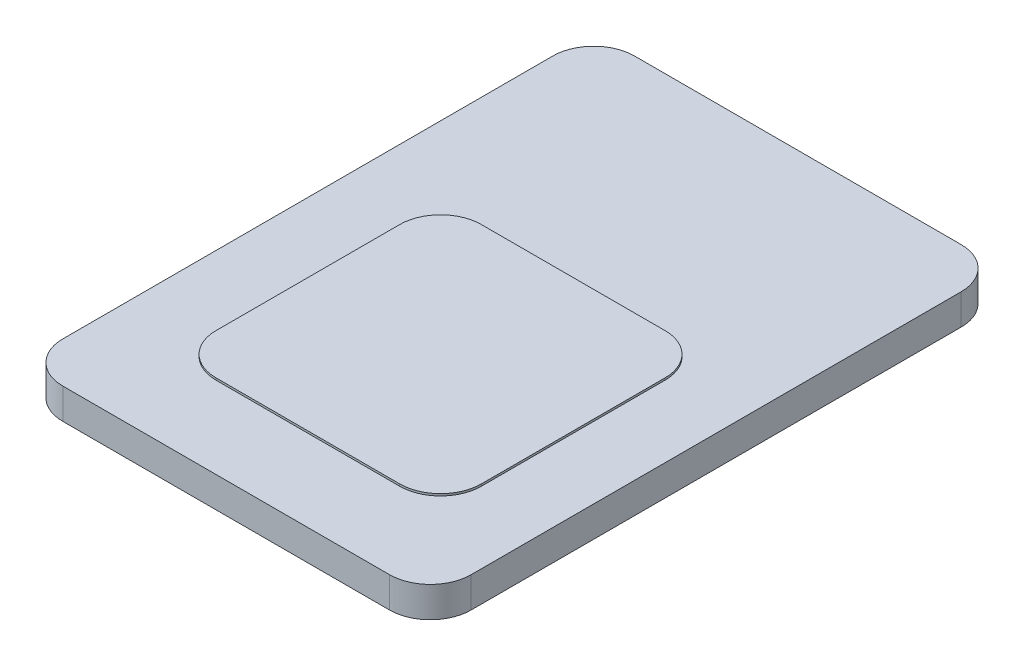
ISO-10303-21;
HEADER;
FILE_DESCRIPTION(('STEP AP214'),'2;1');
FILE_NAME('part.step','',(''),(''),'','','');
FILE_SCHEMA(('AUTOMOTIVE_DESIGN { 1 0 10303 214 1 1 1 1 }'));
ENDSEC;
DATA;
#1=APPLICATION_CONTEXT('core data for automotive mechanical design processes');
#2=APPLICATION_PROTOCOL_DEFINITION('international standard','automotive_design',2000,#1);
#3=PRODUCT_CONTEXT('',#1,'mechanical');
#4=PRODUCT('Part','Part','',(#3));
#5=PRODUCT_RELATED_PRODUCT_CATEGORY('part','',(#4));
#6=PRODUCT_DEFINITION_FORMATION('','',#4);
#7=PRODUCT_DEFINITION_CONTEXT('part definition',#1,'design');
#8=PRODUCT_DEFINITION('design','',#6,#7);
#9=PRODUCT_DEFINITION_SHAPE('','',#8);
#10=(LENGTH_UNIT() NAMED_UNIT(*) SI_UNIT(.MILLI.,.METRE.));
#11=(NAMED_UNIT(*) PLANE_ANGLE_UNIT() SI_UNIT($,.RADIAN.));
#12=(NAMED_UNIT(*) SI_UNIT($,.STERADIAN.) SOLID_ANGLE_UNIT());
#13=UNCERTAINTY_MEASURE_WITH_UNIT(LENGTH_MEASURE(1.E-05),#10,'distance_accuracy_value','');
#14=(GEOMETRIC_REPRESENTATION_CONTEXT(3) GLOBAL_UNCERTAINTY_ASSIGNED_CONTEXT((#13)) GLOBAL_UNIT_ASSIGNED_CONTEXT((#10,
#11,#12)) REPRESENTATION_CONTEXT('',''));
#15=CARTESIAN_POINT('',(0.,0.,0.));
#16=DIRECTION('',(0.,0.,1.));
#17=DIRECTION('',(1.,0.,0.));
#18=AXIS2_PLACEMENT_3D('',#15,#16,#17);
#19=CARTESIAN_POINT('',(0.,1.5,0.));
#20=DIRECTION('',(0.,-1.,0.));
#21=DIRECTION('',(0.,0.,-1.));
#22=AXIS2_PLACEMENT_3D('',#19,#20,#21);
#23=PLANE('',#22);
#24=DIRECTION('',(1.,0.,0.));
#25=VECTOR('',#24,1.);
#26=CARTESIAN_POINT('',(0.,1.5,0.));
#27=LINE('',#26,#25);
#28=CARTESIAN_POINT('',(2.,1.5,0.));
#29=VERTEX_POINT('',#28);
#30=CARTESIAN_POINT('',(18.,1.5,0.));
#31=VERTEX_POINT('',#30);
#32=EDGE_CURVE('E196',#29,#31,#27,.T.);
#33=ORIENTED_EDGE('',*,*,#32,.T.);
#34=CARTESIAN_POINT('',(18.,1.5,-2.));
#35=DIRECTION('',(0.,-1.,0.));
#36=DIRECTION('',(0.,0.,-1.));
#37=AXIS2_PLACEMENT_3D('',#34,#35,#36);
#38=CIRCLE('',#37,2.);
#39=CARTESIAN_POINT('',(20.,1.5,-2.));
#40=VERTEX_POINT('',#39);
#41=EDGE_CURVE('E250',#31,#40,#38,.F.);
#42=ORIENTED_EDGE('',*,*,#41,.T.);
#43=DIRECTION('',(0.,0.,-1.));
#44=VECTOR('',#43,1.);
#45=CARTESIAN_POINT('',(20.,1.5,0.));
#46=LINE('',#45,#44);
#47=CARTESIAN_POINT('',(20.,1.5,-26.));
#48=VERTEX_POINT('',#47);
#49=EDGE_CURVE('E201',#40,#48,#46,.T.);
#50=ORIENTED_EDGE('',*,*,#49,.T.);
#51=CARTESIAN_POINT('',(18.,1.5,-26.));
#52=DIRECTION('',(0.,-1.,0.));
#53=DIRECTION('',(0.,0.,-1.));
#54=AXIS2_PLACEMENT_3D('',#51,#52,#53);
#55=CIRCLE('',#54,2.);
#56=CARTESIAN_POINT('',(18.,1.5,-28.));
#57=VERTEX_POINT('',#56);
#58=EDGE_CURVE('E60',#48,#57,#55,.F.);
#59=ORIENTED_EDGE('',*,*,#58,.T.);
#60=DIRECTION('',(-1.,0.,0.));
#61=VECTOR('',#60,1.);
#62=CARTESIAN_POINT('',(0.,1.5,-28.));
#63=LINE('',#62,#61);
#64=CARTESIAN_POINT('',(2.,1.5,-28.));
#65=VERTEX_POINT('',#64);
#66=EDGE_CURVE('E204',#57,#65,#63,.T.);
#67=ORIENTED_EDGE('',*,*,#66,.T.);
#68=CARTESIAN_POINT('',(2.,1.5,-26.));
#69=DIRECTION('',(0.,-1.,0.));
#70=DIRECTION('',(0.,0.,-1.));
#71=AXIS2_PLACEMENT_3D('',#68,#69,#70);
#72=CIRCLE('',#71,2.);
#73=CARTESIAN_POINT('',(0.,1.5,-26.));
#74=VERTEX_POINT('',#73);
#75=EDGE_CURVE('E244',#65,#74,#72,.F.);
#76=ORIENTED_EDGE('',*,*,#75,.T.);
#77=DIRECTION('',(0.,0.,1.));
#78=VECTOR('',#77,1.);
#79=CARTESIAN_POINT('',(0.,1.5,0.));
#80=LINE('',#79,#78);
#81=CARTESIAN_POINT('',(0.,1.5,-2.));
#82=VERTEX_POINT('',#81);
#83=EDGE_CURVE('E192',#74,#82,#80,.T.);
#84=ORIENTED_EDGE('',*,*,#83,.T.);
#85=CARTESIAN_POINT('',(2.,1.5,-2.));
#86=DIRECTION('',(0.,-1.,0.));
#87=DIRECTION('',(0.,0.,-1.));
#88=AXIS2_PLACEMENT_3D('',#85,#86,#87);
#89=CIRCLE('',#88,2.);
#90=EDGE_CURVE('E247',#82,#29,#89,.F.);
#91=ORIENTED_EDGE('',*,*,#90,.T.);
#92=EDGE_LOOP('',(#33,#42,#50,#59,#67,#76,#84,#91));
#93=FACE_BOUND('',#92,.T.);
#94=CARTESIAN_POINT('',(5.5,1.5,-6.));
#95=DIRECTION('',(0.,1.,0.));
#96=DIRECTION('',(0.,0.,1.));
#97=AXIS2_PLACEMENT_3D('',#94,#95,#96);
#98=CIRCLE('',#97,2.);
#99=CARTESIAN_POINT('',(3.5,1.5,-6.00000000000001));
#100=VERTEX_POINT('',#99);
#101=CARTESIAN_POINT('',(5.50000000000002,1.5,-4.));
#102=VERTEX_POINT('',#101);
#103=EDGE_CURVE('E179',#100,#102,#98,.T.);
#104=ORIENTED_EDGE('',*,*,#103,.F.);
#105=DIRECTION('',(0.,0.,1.));
#106=VECTOR('',#105,1.);
#107=CARTESIAN_POINT('',(3.5,1.5,-15.));
#108=LINE('',#107,#106);
#109=CARTESIAN_POINT('',(3.5,1.5,-15.));
#110=VERTEX_POINT('',#109);
#111=EDGE_CURVE('E176',#110,#100,#108,.T.);
#112=ORIENTED_EDGE('',*,*,#111,.F.);
#113=CARTESIAN_POINT('',(5.5,1.5,-15.));
#114=DIRECTION('',(0.,1.,0.));
#115=DIRECTION('',(0.,0.,-1.));
#116=AXIS2_PLACEMENT_3D('',#113,#114,#115);
#117=CIRCLE('',#116,2.);
#118=CARTESIAN_POINT('',(5.5,1.5,-17.));
#119=VERTEX_POINT('',#118);
#120=EDGE_CURVE('E493',#119,#110,#117,.T.);
#121=ORIENTED_EDGE('',*,*,#120,.F.);
#122=DIRECTION('',(-1.,0.,0.));
#123=VECTOR('',#122,1.);
#124=CARTESIAN_POINT('',(5.50000000000001,1.5,-17.));
#125=LINE('',#124,#123);
#126=CARTESIAN_POINT('',(14.5,1.5,-17.));
#127=VERTEX_POINT('',#126);
#128=EDGE_CURVE('E497',#127,#119,#125,.T.);
#129=ORIENTED_EDGE('',*,*,#128,.F.);
#130=CARTESIAN_POINT('',(14.5,1.5,-15.));
#131=DIRECTION('',(0.,1.,0.));
#132=DIRECTION('',(0.,0.,-1.));
#133=AXIS2_PLACEMENT_3D('',#130,#131,#132);
#134=CIRCLE('',#133,2.);
#135=CARTESIAN_POINT('',(16.5,1.5,-15.));
#136=VERTEX_POINT('',#135);
#137=EDGE_CURVE('E501',#136,#127,#134,.T.);
#138=ORIENTED_EDGE('',*,*,#137,.F.);
#139=DIRECTION('',(0.,0.,-1.));
#140=VECTOR('',#139,1.);
#141=CARTESIAN_POINT('',(16.5,1.5,-15.));
#142=LINE('',#141,#140);
#143=CARTESIAN_POINT('',(16.5,1.5,-6.00000000000001));
#144=VERTEX_POINT('',#143);
#145=EDGE_CURVE('E463',#144,#136,#142,.T.);
#146=ORIENTED_EDGE('',*,*,#145,.F.);
#147=CARTESIAN_POINT('',(14.5,1.5,-6.));
#148=DIRECTION('',(0.,1.,0.));
#149=DIRECTION('',(0.,0.,-1.));
#150=AXIS2_PLACEMENT_3D('',#147,#148,#149);
#151=CIRCLE('',#150,2.);
#152=CARTESIAN_POINT('',(14.5,1.5,-4.));
#153=VERTEX_POINT('',#152);
#154=EDGE_CURVE('E459',#153,#144,#151,.T.);
#155=ORIENTED_EDGE('',*,*,#154,.F.);
#156=DIRECTION('',(1.,0.,0.));
#157=VECTOR('',#156,1.);
#158=CARTESIAN_POINT('',(5.50000000000002,1.5,-4.));
#159=LINE('',#158,#157);
#160=EDGE_CURVE('E464',#102,#153,#159,.T.);
#161=ORIENTED_EDGE('',*,*,#160,.F.);
#162=EDGE_LOOP('',(#104,#112,#121,#129,#138,#146,#155,#161));
#163=FACE_BOUND('',#162,.T.);
#164=ADVANCED_FACE('F39',(#93,#163),#23,.F.);
#165=CARTESIAN_POINT('',(0.,1.5,0.));
#166=DIRECTION('',(1.,0.,0.));
#167=DIRECTION('',(0.,0.,-1.));
#168=AXIS2_PLACEMENT_3D('',#165,#166,#167);
#169=PLANE('',#168);
#170=DIRECTION('',(0.,0.,1.));
#171=VECTOR('',#170,1.);
#172=CARTESIAN_POINT('',(0.,0.,0.));
#173=LINE('',#172,#171);
#174=CARTESIAN_POINT('',(0.,0.,-26.));
#175=VERTEX_POINT('',#174);
#176=CARTESIAN_POINT('',(0.,0.,-2.));
#177=VERTEX_POINT('',#176);
#178=EDGE_CURVE('E181',#175,#177,#173,.T.);
#179=ORIENTED_EDGE('',*,*,#178,.T.);
#180=DIRECTION('',(0.,-1.,0.));
#181=VECTOR('',#180,1.);
#182=CARTESIAN_POINT('',(0.,1.5,-2.));
#183=LINE('',#182,#181);
#184=EDGE_CURVE('E257',#177,#82,#183,.F.);
#185=ORIENTED_EDGE('',*,*,#184,.T.);
#186=ORIENTED_EDGE('',*,*,#83,.F.);
#187=DIRECTION('',(0.,-1.,0.));
#188=VECTOR('',#187,1.);
#189=CARTESIAN_POINT('',(0.,1.5,-26.));
#190=LINE('',#189,#188);
#191=EDGE_CURVE('E253',#74,#175,#190,.T.);
#192=ORIENTED_EDGE('',*,*,#191,.T.);
#193=EDGE_LOOP('',(#179,#185,#186,#192));
#194=FACE_BOUND('',#193,.T.);
#195=ADVANCED_FACE('F275',(#194),#169,.F.);
#196=CARTESIAN_POINT('',(0.,1.5,0.));
#197=DIRECTION('',(0.,0.,-1.));
#198=DIRECTION('',(-1.,0.,0.));
#199=AXIS2_PLACEMENT_3D('',#196,#197,#198);
#200=PLANE('',#199);
#201=DIRECTION('',(1.,0.,0.));
#202=VECTOR('',#201,1.);
#203=CARTESIAN_POINT('',(0.,0.,0.));
#204=LINE('',#203,#202);
#205=CARTESIAN_POINT('',(2.,0.,0.));
#206=VERTEX_POINT('',#205);
#207=CARTESIAN_POINT('',(18.,0.,0.));
#208=VERTEX_POINT('',#207);
#209=EDGE_CURVE('E186',#206,#208,#204,.T.);
#210=ORIENTED_EDGE('',*,*,#209,.T.);
#211=DIRECTION('',(0.,-1.,0.));
#212=VECTOR('',#211,1.);
#213=CARTESIAN_POINT('',(18.,1.5,0.));
#214=LINE('',#213,#212);
#215=EDGE_CURVE('E239',#208,#31,#214,.F.);
#216=ORIENTED_EDGE('',*,*,#215,.T.);
#217=ORIENTED_EDGE('',*,*,#32,.F.);
#218=DIRECTION('',(0.,-1.,0.));
#219=VECTOR('',#218,1.);
#220=CARTESIAN_POINT('',(2.,1.5,0.));
#221=LINE('',#220,#219);
#222=EDGE_CURVE('E235',#29,#206,#221,.T.);
#223=ORIENTED_EDGE('',*,*,#222,.T.);
#224=EDGE_LOOP('',(#210,#216,#217,#223));
#225=FACE_BOUND('',#224,.T.);
#226=ADVANCED_FACE('F285',(#225),#200,.F.);
#227=CARTESIAN_POINT('',(20.,1.5,0.));
#228=DIRECTION('',(-1.,0.,0.));
#229=DIRECTION('',(0.,0.,1.));
#230=AXIS2_PLACEMENT_3D('',#227,#228,#229);
#231=PLANE('',#230);
#232=ORIENTED_EDGE('',*,*,#49,.F.);
#233=DIRECTION('',(0.,-1.,0.));
#234=VECTOR('',#233,1.);
#235=CARTESIAN_POINT('',(20.,1.5,-2.));
#236=LINE('',#235,#234);
#237=CARTESIAN_POINT('',(20.,0.,-2.));
#238=VERTEX_POINT('',#237);
#239=EDGE_CURVE('E219',#40,#238,#236,.T.);
#240=ORIENTED_EDGE('',*,*,#239,.T.);
#241=DIRECTION('',(0.,0.,-1.));
#242=VECTOR('',#241,1.);
#243=CARTESIAN_POINT('',(20.,0.,0.));
#244=LINE('',#243,#242);
#245=CARTESIAN_POINT('',(20.,0.,-26.));
#246=VERTEX_POINT('',#245);
#247=EDGE_CURVE('E211',#238,#246,#244,.T.);
#248=ORIENTED_EDGE('',*,*,#247,.T.);
#249=DIRECTION('',(0.,-1.,0.));
#250=VECTOR('',#249,1.);
#251=CARTESIAN_POINT('',(20.,1.5,-26.));
#252=LINE('',#251,#250);
#253=EDGE_CURVE('E206',#246,#48,#252,.F.);
#254=ORIENTED_EDGE('',*,*,#253,.T.);
#255=EDGE_LOOP('',(#232,#240,#248,#254));
#256=FACE_BOUND('',#255,.T.);
#257=ADVANCED_FACE('F293',(#256),#231,.F.);
#258=CARTESIAN_POINT('',(0.,1.5,-28.));
#259=DIRECTION('',(0.,0.,1.));
#260=DIRECTION('',(1.,0.,0.));
#261=AXIS2_PLACEMENT_3D('',#258,#259,#260);
#262=PLANE('',#261);
#263=DIRECTION('',(-1.,0.,0.));
#264=VECTOR('',#263,1.);
#265=CARTESIAN_POINT('',(0.,0.,-28.));
#266=LINE('',#265,#264);
#267=CARTESIAN_POINT('',(18.,0.,-28.));
#268=VERTEX_POINT('',#267);
#269=CARTESIAN_POINT('',(2.,0.,-28.));
#270=VERTEX_POINT('',#269);
#271=EDGE_CURVE('E197',#268,#270,#266,.T.);
#272=ORIENTED_EDGE('',*,*,#271,.T.);
#273=DIRECTION('',(0.,-1.,0.));
#274=VECTOR('',#273,1.);
#275=CARTESIAN_POINT('',(2.,1.5,-28.));
#276=LINE('',#275,#274);
#277=EDGE_CURVE('E11',#270,#65,#276,.F.);
#278=ORIENTED_EDGE('',*,*,#277,.T.);
#279=ORIENTED_EDGE('',*,*,#66,.F.);
#280=DIRECTION('',(0.,-1.,0.));
#281=VECTOR('',#280,1.);
#282=CARTESIAN_POINT('',(18.,1.5,-28.));
#283=LINE('',#282,#281);
#284=EDGE_CURVE('E48',#57,#268,#283,.T.);
#285=ORIENTED_EDGE('',*,*,#284,.T.);
#286=EDGE_LOOP('',(#272,#278,#279,#285));
#287=FACE_BOUND('',#286,.T.);
#288=ADVANCED_FACE('F263',(#287),#262,.F.);
#289=CARTESIAN_POINT('',(0.,0.,0.));
#290=DIRECTION('',(0.,-1.,0.));
#291=DIRECTION('',(0.,0.,-1.));
#292=AXIS2_PLACEMENT_3D('',#289,#290,#291);
#293=PLANE('',#292);
#294=ORIENTED_EDGE('',*,*,#247,.F.);
#295=CARTESIAN_POINT('',(18.,0.,-2.));
#296=DIRECTION('',(0.,-1.,0.));
#297=DIRECTION('',(0.,0.,-1.));
#298=AXIS2_PLACEMENT_3D('',#295,#296,#297);
#299=CIRCLE('',#298,2.);
#300=EDGE_CURVE('E232',#238,#208,#299,.T.);
#301=ORIENTED_EDGE('',*,*,#300,.T.);
#302=ORIENTED_EDGE('',*,*,#209,.F.);
#303=CARTESIAN_POINT('',(2.,0.,-2.));
#304=DIRECTION('',(0.,-1.,0.));
#305=DIRECTION('',(0.,0.,-1.));
#306=AXIS2_PLACEMENT_3D('',#303,#304,#305);
#307=CIRCLE('',#306,2.);
#308=EDGE_CURVE('E229',#206,#177,#307,.T.);
#309=ORIENTED_EDGE('',*,*,#308,.T.);
#310=ORIENTED_EDGE('',*,*,#178,.F.);
#311=CARTESIAN_POINT('',(2.,0.,-26.));
#312=DIRECTION('',(0.,-1.,0.));
#313=DIRECTION('',(0.,0.,-1.));
#314=AXIS2_PLACEMENT_3D('',#311,#312,#313);
#315=CIRCLE('',#314,2.);
#316=EDGE_CURVE('E226',#175,#270,#315,.T.);
#317=ORIENTED_EDGE('',*,*,#316,.T.);
#318=ORIENTED_EDGE('',*,*,#271,.F.);
#319=CARTESIAN_POINT('',(18.,0.,-26.));
#320=DIRECTION('',(0.,-1.,0.));
#321=DIRECTION('',(0.,0.,-1.));
#322=AXIS2_PLACEMENT_3D('',#319,#320,#321);
#323=CIRCLE('',#322,2.);
#324=EDGE_CURVE('E223',#268,#246,#323,.T.);
#325=ORIENTED_EDGE('',*,*,#324,.T.);
#326=EDGE_LOOP('',(#294,#301,#302,#309,#310,#317,#318,#325));
#327=FACE_BOUND('',#326,.T.);
#328=ADVANCED_FACE('F267',(#327),#293,.T.);
#329=CARTESIAN_POINT('',(5.5,1.6,-6.));
#330=DIRECTION('',(0.,-1.,0.));
#331=DIRECTION('',(0.,0.,-1.));
#332=AXIS2_PLACEMENT_3D('',#329,#330,#331);
#333=CYLINDRICAL_SURFACE('',#332,2.);
#334=ORIENTED_EDGE('',*,*,#103,.T.);
#335=DIRECTION('',(0.,-1.,0.));
#336=VECTOR('',#335,1.);
#337=CARTESIAN_POINT('',(5.50000000000002,1.6,-4.));
#338=LINE('',#337,#336);
#339=CARTESIAN_POINT('',(5.50000000000002,1.6,-4.));
#340=VERTEX_POINT('',#339);
#341=EDGE_CURVE('E158',#340,#102,#338,.T.);
#342=ORIENTED_EDGE('',*,*,#341,.F.);
#343=CARTESIAN_POINT('',(5.5,1.6,-6.));
#344=DIRECTION('',(0.,1.,0.));
#345=DIRECTION('',(0.,0.,1.));
#346=AXIS2_PLACEMENT_3D('',#343,#344,#345);
#347=CIRCLE('',#346,2.);
#348=CARTESIAN_POINT('',(3.5,1.6,-6.00000000000001));
#349=VERTEX_POINT('',#348);
#350=EDGE_CURVE('E166',#349,#340,#347,.T.);
#351=ORIENTED_EDGE('',*,*,#350,.F.);
#352=DIRECTION('',(0.,-1.,0.));
#353=VECTOR('',#352,1.);
#354=CARTESIAN_POINT('',(3.5,1.6,-6.00000000000001));
#355=LINE('',#354,#353);
#356=EDGE_CURVE('E487',#349,#100,#355,.T.);
#357=ORIENTED_EDGE('',*,*,#356,.T.);
#358=EDGE_LOOP('',(#334,#342,#351,#357));
#359=FACE_BOUND('',#358,.T.);
#360=ADVANCED_FACE('F178',(#359),#333,.T.);
#361=CARTESIAN_POINT('',(5.50000000000002,1.6,-4.));
#362=DIRECTION('',(0.,0.,-1.));
#363=DIRECTION('',(-1.,0.,0.));
#364=AXIS2_PLACEMENT_3D('',#361,#362,#363);
#365=PLANE('',#364);
#366=ORIENTED_EDGE('',*,*,#160,.T.);
#367=DIRECTION('',(0.,-1.,0.));
#368=VECTOR('',#367,1.);
#369=CARTESIAN_POINT('',(14.5,1.6,-4.));
#370=LINE('',#369,#368);
#371=CARTESIAN_POINT('',(14.5,1.6,-4.));
#372=VERTEX_POINT('',#371);
#373=EDGE_CURVE('E161',#372,#153,#370,.T.);
#374=ORIENTED_EDGE('',*,*,#373,.F.);
#375=DIRECTION('',(1.,0.,0.));
#376=VECTOR('',#375,1.);
#377=CARTESIAN_POINT('',(5.50000000000002,1.6,-4.));
#378=LINE('',#377,#376);
#379=EDGE_CURVE('E153',#340,#372,#378,.T.);
#380=ORIENTED_EDGE('',*,*,#379,.F.);
#381=ORIENTED_EDGE('',*,*,#341,.T.);
#382=EDGE_LOOP('',(#366,#374,#380,#381));
#383=FACE_BOUND('',#382,.T.);
#384=ADVANCED_FACE('F156',(#383),#365,.F.);
#385=CARTESIAN_POINT('',(14.5,1.6,-6.));
#386=DIRECTION('',(0.,-1.,0.));
#387=DIRECTION('',(0.,0.,-1.));
#388=AXIS2_PLACEMENT_3D('',#385,#386,#387);
#389=CYLINDRICAL_SURFACE('',#388,2.);
#390=ORIENTED_EDGE('',*,*,#154,.T.);
#391=DIRECTION('',(0.,-1.,0.));
#392=VECTOR('',#391,1.);
#393=CARTESIAN_POINT('',(16.5,1.6,-6.00000000000001));
#394=LINE('',#393,#392);
#395=CARTESIAN_POINT('',(16.5,1.6,-6.00000000000001));
#396=VERTEX_POINT('',#395);
#397=EDGE_CURVE('E188',#396,#144,#394,.T.);
#398=ORIENTED_EDGE('',*,*,#397,.F.);
#399=CARTESIAN_POINT('',(14.5,1.6,-6.));
#400=DIRECTION('',(0.,1.,0.));
#401=DIRECTION('',(0.,0.,-1.));
#402=AXIS2_PLACEMENT_3D('',#399,#400,#401);
#403=CIRCLE('',#402,2.);
#404=EDGE_CURVE('E165',#372,#396,#403,.T.);
#405=ORIENTED_EDGE('',*,*,#404,.F.);
#406=ORIENTED_EDGE('',*,*,#373,.T.);
#407=EDGE_LOOP('',(#390,#398,#405,#406));
#408=FACE_BOUND('',#407,.T.);
#409=ADVANCED_FACE('F392',(#408),#389,.T.);
#410=CARTESIAN_POINT('',(16.5,1.6,-15.));
#411=DIRECTION('',(-1.,0.,0.));
#412=DIRECTION('',(0.,0.,1.));
#413=AXIS2_PLACEMENT_3D('',#410,#411,#412);
#414=PLANE('',#413);
#415=ORIENTED_EDGE('',*,*,#145,.T.);
#416=DIRECTION('',(0.,-1.,0.));
#417=VECTOR('',#416,1.);
#418=CARTESIAN_POINT('',(16.5,1.6,-15.));
#419=LINE('',#418,#417);
#420=CARTESIAN_POINT('',(16.5,1.6,-15.));
#421=VERTEX_POINT('',#420);
#422=EDGE_CURVE('E471',#421,#136,#419,.T.);
#423=ORIENTED_EDGE('',*,*,#422,.F.);
#424=DIRECTION('',(0.,0.,-1.));
#425=VECTOR('',#424,1.);
#426=CARTESIAN_POINT('',(16.5,1.6,-15.));
#427=LINE('',#426,#425);
#428=EDGE_CURVE('E469',#396,#421,#427,.T.);
#429=ORIENTED_EDGE('',*,*,#428,.F.);
#430=ORIENTED_EDGE('',*,*,#397,.T.);
#431=EDGE_LOOP('',(#415,#423,#429,#430));
#432=FACE_BOUND('',#431,.T.);
#433=ADVANCED_FACE('F383',(#432),#414,.F.);
#434=CARTESIAN_POINT('',(14.5,1.6,-15.));
#435=DIRECTION('',(0.,-1.,0.));
#436=DIRECTION('',(0.,0.,-1.));
#437=AXIS2_PLACEMENT_3D('',#434,#435,#436);
#438=CYLINDRICAL_SURFACE('',#437,2.);
#439=ORIENTED_EDGE('',*,*,#137,.T.);
#440=DIRECTION('',(0.,-1.,0.));
#441=VECTOR('',#440,1.);
#442=CARTESIAN_POINT('',(14.5,1.6,-17.));
#443=LINE('',#442,#441);
#444=CARTESIAN_POINT('',(14.5,1.6,-17.));
#445=VERTEX_POINT('',#444);
#446=EDGE_CURVE('E473',#445,#127,#443,.T.);
#447=ORIENTED_EDGE('',*,*,#446,.F.);
#448=CARTESIAN_POINT('',(14.5,1.6,-15.));
#449=DIRECTION('',(0.,1.,0.));
#450=DIRECTION('',(0.,0.,-1.));
#451=AXIS2_PLACEMENT_3D('',#448,#449,#450);
#452=CIRCLE('',#451,2.);
#453=EDGE_CURVE('E519',#421,#445,#452,.T.);
#454=ORIENTED_EDGE('',*,*,#453,.F.);
#455=ORIENTED_EDGE('',*,*,#422,.T.);
#456=EDGE_LOOP('',(#439,#447,#454,#455));
#457=FACE_BOUND('',#456,.T.);
#458=ADVANCED_FACE('F374',(#457),#438,.T.);
#459=CARTESIAN_POINT('',(5.50000000000001,1.6,-17.));
#460=DIRECTION('',(0.,0.,1.));
#461=DIRECTION('',(1.,0.,0.));
#462=AXIS2_PLACEMENT_3D('',#459,#460,#461);
#463=PLANE('',#462);
#464=ORIENTED_EDGE('',*,*,#128,.T.);
#465=DIRECTION('',(0.,-1.,0.));
#466=VECTOR('',#465,1.);
#467=CARTESIAN_POINT('',(5.5,1.6,-17.));
#468=LINE('',#467,#466);
#469=CARTESIAN_POINT('',(5.5,1.6,-17.));
#470=VERTEX_POINT('',#469);
#471=EDGE_CURVE('E479',#470,#119,#468,.T.);
#472=ORIENTED_EDGE('',*,*,#471,.F.);
#473=DIRECTION('',(-1.,0.,0.));
#474=VECTOR('',#473,1.);
#475=CARTESIAN_POINT('',(5.50000000000001,1.6,-17.));
#476=LINE('',#475,#474);
#477=EDGE_CURVE('E516',#445,#470,#476,.T.);
#478=ORIENTED_EDGE('',*,*,#477,.F.);
#479=ORIENTED_EDGE('',*,*,#446,.T.);
#480=EDGE_LOOP('',(#464,#472,#478,#479));
#481=FACE_BOUND('',#480,.T.);
#482=ADVANCED_FACE('F365',(#481),#463,.F.);
#483=CARTESIAN_POINT('',(5.5,1.6,-15.));
#484=DIRECTION('',(0.,-1.,0.));
#485=DIRECTION('',(0.,0.,-1.));
#486=AXIS2_PLACEMENT_3D('',#483,#484,#485);
#487=CYLINDRICAL_SURFACE('',#486,2.);
#488=ORIENTED_EDGE('',*,*,#120,.T.);
#489=DIRECTION('',(0.,-1.,0.));
#490=VECTOR('',#489,1.);
#491=CARTESIAN_POINT('',(3.5,1.6,-15.));
#492=LINE('',#491,#490);
#493=CARTESIAN_POINT('',(3.5,1.6,-15.));
#494=VERTEX_POINT('',#493);
#495=EDGE_CURVE('E483',#494,#110,#492,.T.);
#496=ORIENTED_EDGE('',*,*,#495,.F.);
#497=CARTESIAN_POINT('',(5.5,1.6,-15.));
#498=DIRECTION('',(0.,1.,0.));
#499=DIRECTION('',(0.,0.,-1.));
#500=AXIS2_PLACEMENT_3D('',#497,#498,#499);
#501=CIRCLE('',#500,2.);
#502=EDGE_CURVE('E513',#470,#494,#501,.T.);
#503=ORIENTED_EDGE('',*,*,#502,.F.);
#504=ORIENTED_EDGE('',*,*,#471,.T.);
#505=EDGE_LOOP('',(#488,#496,#503,#504));
#506=FACE_BOUND('',#505,.T.);
#507=ADVANCED_FACE('F356',(#506),#487,.T.);
#508=CARTESIAN_POINT('',(3.5,1.6,-15.));
#509=DIRECTION('',(1.,0.,0.));
#510=DIRECTION('',(0.,0.,-1.));
#511=AXIS2_PLACEMENT_3D('',#508,#509,#510);
#512=PLANE('',#511);
#513=ORIENTED_EDGE('',*,*,#111,.T.);
#514=ORIENTED_EDGE('',*,*,#356,.F.);
#515=DIRECTION('',(0.,0.,1.));
#516=VECTOR('',#515,1.);
#517=CARTESIAN_POINT('',(3.5,1.6,-15.));
#518=LINE('',#517,#516);
#519=EDGE_CURVE('E171',#494,#349,#518,.T.);
#520=ORIENTED_EDGE('',*,*,#519,.F.);
#521=ORIENTED_EDGE('',*,*,#495,.T.);
#522=EDGE_LOOP('',(#513,#514,#520,#521));
#523=FACE_BOUND('',#522,.T.);
#524=ADVANCED_FACE('F348',(#523),#512,.F.);
#525=CARTESIAN_POINT('',(5.5,1.6,-6.));
#526=DIRECTION('',(0.,1.,0.));
#527=DIRECTION('',(0.,0.,1.));
#528=AXIS2_PLACEMENT_3D('',#525,#526,#527);
#529=PLANE('',#528);
#530=ORIENTED_EDGE('',*,*,#350,.T.);
#531=ORIENTED_EDGE('',*,*,#379,.T.);
#532=ORIENTED_EDGE('',*,*,#404,.T.);
#533=ORIENTED_EDGE('',*,*,#428,.T.);
#534=ORIENTED_EDGE('',*,*,#453,.T.);
#535=ORIENTED_EDGE('',*,*,#477,.T.);
#536=ORIENTED_EDGE('',*,*,#502,.T.);
#537=ORIENTED_EDGE('',*,*,#519,.T.);
#538=EDGE_LOOP('',(#530,#531,#532,#533,#534,#535,#536,#537));
#539=FACE_BOUND('',#538,.T.);
#540=ADVANCED_FACE('F169',(#539),#529,.T.);
#541=CARTESIAN_POINT('',(18.,1.5,-2.));
#542=DIRECTION('',(0.,-1.,0.));
#543=DIRECTION('',(0.,0.,-1.));
#544=AXIS2_PLACEMENT_3D('',#541,#542,#543);
#545=CYLINDRICAL_SURFACE('',#544,2.);
#546=ORIENTED_EDGE('',*,*,#41,.F.);
#547=ORIENTED_EDGE('',*,*,#215,.F.);
#548=ORIENTED_EDGE('',*,*,#300,.F.);
#549=ORIENTED_EDGE('',*,*,#239,.F.);
#550=EDGE_LOOP('',(#546,#547,#548,#549));
#551=FACE_BOUND('',#550,.T.);
#552=ADVANCED_FACE('F290',(#551),#545,.T.);
#553=CARTESIAN_POINT('',(2.,1.5,-2.));
#554=DIRECTION('',(0.,-1.,0.));
#555=DIRECTION('',(0.,0.,-1.));
#556=AXIS2_PLACEMENT_3D('',#553,#554,#555);
#557=CYLINDRICAL_SURFACE('',#556,2.);
#558=ORIENTED_EDGE('',*,*,#90,.F.);
#559=ORIENTED_EDGE('',*,*,#184,.F.);
#560=ORIENTED_EDGE('',*,*,#308,.F.);
#561=ORIENTED_EDGE('',*,*,#222,.F.);
#562=EDGE_LOOP('',(#558,#559,#560,#561));
#563=FACE_BOUND('',#562,.T.);
#564=ADVANCED_FACE('F282',(#563),#557,.T.);
#565=CARTESIAN_POINT('',(2.,1.5,-26.));
#566=DIRECTION('',(0.,-1.,0.));
#567=DIRECTION('',(0.,0.,-1.));
#568=AXIS2_PLACEMENT_3D('',#565,#566,#567);
#569=CYLINDRICAL_SURFACE('',#568,2.);
#570=ORIENTED_EDGE('',*,*,#75,.F.);
#571=ORIENTED_EDGE('',*,*,#277,.F.);
#572=ORIENTED_EDGE('',*,*,#316,.F.);
#573=ORIENTED_EDGE('',*,*,#191,.F.);
#574=EDGE_LOOP('',(#570,#571,#572,#573));
#575=FACE_BOUND('',#574,.T.);
#576=ADVANCED_FACE('F272',(#575),#569,.T.);
#577=CARTESIAN_POINT('',(18.,1.5,-26.));
#578=DIRECTION('',(0.,-1.,0.));
#579=DIRECTION('',(0.,0.,-1.));
#580=AXIS2_PLACEMENT_3D('',#577,#578,#579);
#581=CYLINDRICAL_SURFACE('',#580,2.);
#582=ORIENTED_EDGE('',*,*,#58,.F.);
#583=ORIENTED_EDGE('',*,*,#253,.F.);
#584=ORIENTED_EDGE('',*,*,#324,.F.);
#585=ORIENTED_EDGE('',*,*,#284,.F.);
#586=EDGE_LOOP('',(#582,#583,#584,#585));
#587=FACE_BOUND('',#586,.T.);
#588=ADVANCED_FACE('F41',(#587),#581,.T.);
#589=CLOSED_SHELL('',(#164,#195,#226,#257,#288,#328,#360,#384,#409,#433,#458,#482,#507,#524,
#540,#552,#564,#576,#588));
#590=MANIFOLD_SOLID_BREP('B2',#589);
#591=ADVANCED_BREP_SHAPE_REPRESENTATION('',(#18,#590),#14);
#592=SHAPE_DEFINITION_REPRESENTATION(#9,#591);
ENDSEC;
END-ISO-10303-21;
